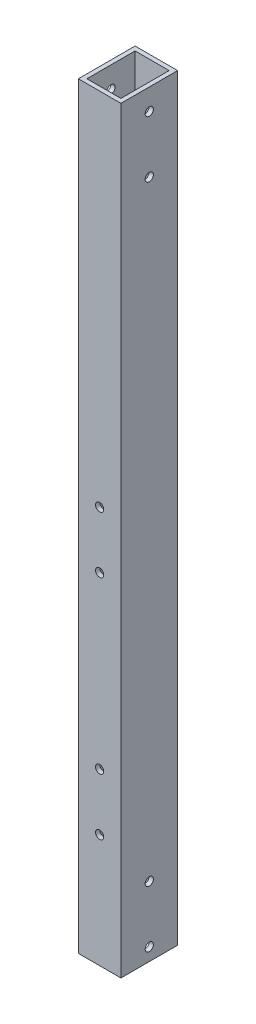
ISO-10303-21;
HEADER;
FILE_DESCRIPTION(('STEP AP214'),'2;1');
FILE_NAME('part.step','',(''),(''),'','','');
FILE_SCHEMA(('AUTOMOTIVE_DESIGN { 1 0 10303 214 1 1 1 1 }'));
ENDSEC;
DATA;
#1=APPLICATION_CONTEXT('core data for automotive mechanical design processes');
#2=APPLICATION_PROTOCOL_DEFINITION('international standard','automotive_design',2000,#1);
#3=PRODUCT_CONTEXT('',#1,'mechanical');
#4=PRODUCT('Part','Part','',(#3));
#5=PRODUCT_RELATED_PRODUCT_CATEGORY('part','',(#4));
#6=PRODUCT_DEFINITION_FORMATION('','',#4);
#7=PRODUCT_DEFINITION_CONTEXT('part definition',#1,'design');
#8=PRODUCT_DEFINITION('design','',#6,#7);
#9=PRODUCT_DEFINITION_SHAPE('','',#8);
#10=(LENGTH_UNIT() NAMED_UNIT(*) SI_UNIT(.MILLI.,.METRE.));
#11=(NAMED_UNIT(*) PLANE_ANGLE_UNIT() SI_UNIT($,.RADIAN.));
#12=(NAMED_UNIT(*) SI_UNIT($,.STERADIAN.) SOLID_ANGLE_UNIT());
#13=UNCERTAINTY_MEASURE_WITH_UNIT(LENGTH_MEASURE(1.E-05),#10,'distance_accuracy_value','');
#14=(GEOMETRIC_REPRESENTATION_CONTEXT(3) GLOBAL_UNCERTAINTY_ASSIGNED_CONTEXT((#13)) GLOBAL_UNIT_ASSIGNED_CONTEXT((#10,
#11,#12)) REPRESENTATION_CONTEXT('',''));
#15=CARTESIAN_POINT('',(0.,0.,0.));
#16=DIRECTION('',(0.,0.,1.));
#17=DIRECTION('',(1.,0.,0.));
#18=AXIS2_PLACEMENT_3D('',#15,#16,#17);
#19=CARTESIAN_POINT('',(0.,267.,0.));
#20=DIRECTION('',(0.,1.,0.));
#21=DIRECTION('',(0.,0.,1.));
#22=AXIS2_PLACEMENT_3D('',#19,#20,#21);
#23=PLANE('',#22);
#24=DIRECTION('',(0.,0.,-1.));
#25=VECTOR('',#24,1.);
#26=CARTESIAN_POINT('',(7.5,267.,10.));
#27=LINE('',#26,#25);
#28=CARTESIAN_POINT('',(7.5,267.,10.));
#29=VERTEX_POINT('',#28);
#30=CARTESIAN_POINT('',(7.5,267.,-10.));
#31=VERTEX_POINT('',#30);
#32=EDGE_CURVE('E187',#29,#31,#27,.T.);
#33=ORIENTED_EDGE('',*,*,#32,.T.);
#34=DIRECTION('',(-1.,0.,0.));
#35=VECTOR('',#34,1.);
#36=CARTESIAN_POINT('',(-7.5,267.,-10.));
#37=LINE('',#36,#35);
#38=CARTESIAN_POINT('',(-7.5,267.,-10.));
#39=VERTEX_POINT('',#38);
#40=EDGE_CURVE('E191',#31,#39,#37,.T.);
#41=ORIENTED_EDGE('',*,*,#40,.T.);
#42=DIRECTION('',(0.,0.,1.));
#43=VECTOR('',#42,1.);
#44=CARTESIAN_POINT('',(-7.5,267.,10.));
#45=LINE('',#44,#43);
#46=CARTESIAN_POINT('',(-7.5,267.,10.));
#47=VERTEX_POINT('',#46);
#48=EDGE_CURVE('E195',#39,#47,#45,.T.);
#49=ORIENTED_EDGE('',*,*,#48,.T.);
#50=DIRECTION('',(1.,0.,0.));
#51=VECTOR('',#50,1.);
#52=CARTESIAN_POINT('',(-7.5,267.,10.));
#53=LINE('',#52,#51);
#54=EDGE_CURVE('E198',#47,#29,#53,.T.);
#55=ORIENTED_EDGE('',*,*,#54,.T.);
#56=EDGE_LOOP('',(#33,#41,#49,#55));
#57=FACE_BOUND('',#56,.T.);
#58=DIRECTION('',(-1.,0.,0.));
#59=VECTOR('',#58,1.);
#60=CARTESIAN_POINT('',(0.,267.,-8.5));
#61=LINE('',#60,#59);
#62=CARTESIAN_POINT('',(6.,267.,-8.5));
#63=VERTEX_POINT('',#62);
#64=CARTESIAN_POINT('',(-6.,267.,-8.5));
#65=VERTEX_POINT('',#64);
#66=EDGE_CURVE('E146',#63,#65,#61,.T.);
#67=ORIENTED_EDGE('',*,*,#66,.F.);
#68=DIRECTION('',(0.,0.,-1.));
#69=VECTOR('',#68,1.);
#70=CARTESIAN_POINT('',(6.,267.,0.));
#71=LINE('',#70,#69);
#72=CARTESIAN_POINT('',(6.,267.,8.5));
#73=VERTEX_POINT('',#72);
#74=EDGE_CURVE('E137',#73,#63,#71,.T.);
#75=ORIENTED_EDGE('',*,*,#74,.F.);
#76=DIRECTION('',(1.,0.,0.));
#77=VECTOR('',#76,1.);
#78=CARTESIAN_POINT('',(0.,267.,8.5));
#79=LINE('',#78,#77);
#80=CARTESIAN_POINT('',(-6.,267.,8.5));
#81=VERTEX_POINT('',#80);
#82=EDGE_CURVE('E163',#81,#73,#79,.T.);
#83=ORIENTED_EDGE('',*,*,#82,.F.);
#84=DIRECTION('',(0.,0.,1.));
#85=VECTOR('',#84,1.);
#86=CARTESIAN_POINT('',(-6.,267.,0.));
#87=LINE('',#86,#85);
#88=EDGE_CURVE('E159',#65,#81,#87,.T.);
#89=ORIENTED_EDGE('',*,*,#88,.F.);
#90=EDGE_LOOP('',(#67,#75,#83,#89));
#91=FACE_BOUND('',#90,.T.);
#92=ADVANCED_FACE('F69',(#57,#91),#23,.T.);
#93=CARTESIAN_POINT('',(0.,0.,0.));
#94=DIRECTION('',(0.,1.,0.));
#95=DIRECTION('',(0.,0.,1.));
#96=AXIS2_PLACEMENT_3D('',#93,#94,#95);
#97=PLANE('',#96);
#98=DIRECTION('',(0.,0.,-1.));
#99=VECTOR('',#98,1.);
#100=CARTESIAN_POINT('',(7.5,0.,10.));
#101=LINE('',#100,#99);
#102=CARTESIAN_POINT('',(7.5,0.,10.));
#103=VERTEX_POINT('',#102);
#104=CARTESIAN_POINT('',(7.5,0.,-10.));
#105=VERTEX_POINT('',#104);
#106=EDGE_CURVE('E155',#103,#105,#101,.T.);
#107=ORIENTED_EDGE('',*,*,#106,.F.);
#108=DIRECTION('',(1.,0.,0.));
#109=VECTOR('',#108,1.);
#110=CARTESIAN_POINT('',(-7.5,0.,10.));
#111=LINE('',#110,#109);
#112=CARTESIAN_POINT('',(-7.5,0.,10.));
#113=VERTEX_POINT('',#112);
#114=EDGE_CURVE('E192',#113,#103,#111,.T.);
#115=ORIENTED_EDGE('',*,*,#114,.F.);
#116=DIRECTION('',(0.,0.,1.));
#117=VECTOR('',#116,1.);
#118=CARTESIAN_POINT('',(-7.5,0.,10.));
#119=LINE('',#118,#117);
#120=CARTESIAN_POINT('',(-7.5,0.,-10.));
#121=VERTEX_POINT('',#120);
#122=EDGE_CURVE('E208',#121,#113,#119,.T.);
#123=ORIENTED_EDGE('',*,*,#122,.F.);
#124=DIRECTION('',(-1.,0.,0.));
#125=VECTOR('',#124,1.);
#126=CARTESIAN_POINT('',(-7.5,0.,-10.));
#127=LINE('',#126,#125);
#128=EDGE_CURVE('E205',#105,#121,#127,.T.);
#129=ORIENTED_EDGE('',*,*,#128,.F.);
#130=EDGE_LOOP('',(#107,#115,#123,#129));
#131=FACE_BOUND('',#130,.T.);
#132=DIRECTION('',(0.,0.,-1.));
#133=VECTOR('',#132,1.);
#134=CARTESIAN_POINT('',(6.,0.,0.));
#135=LINE('',#134,#133);
#136=CARTESIAN_POINT('',(6.,0.,8.5));
#137=VERTEX_POINT('',#136);
#138=CARTESIAN_POINT('',(6.,0.,-8.5));
#139=VERTEX_POINT('',#138);
#140=EDGE_CURVE('E95',#137,#139,#135,.T.);
#141=ORIENTED_EDGE('',*,*,#140,.T.);
#142=DIRECTION('',(-1.,0.,0.));
#143=VECTOR('',#142,1.);
#144=CARTESIAN_POINT('',(0.,0.,-8.5));
#145=LINE('',#144,#143);
#146=CARTESIAN_POINT('',(-6.,0.,-8.5));
#147=VERTEX_POINT('',#146);
#148=EDGE_CURVE('E153',#139,#147,#145,.T.);
#149=ORIENTED_EDGE('',*,*,#148,.T.);
#150=DIRECTION('',(0.,0.,1.));
#151=VECTOR('',#150,1.);
#152=CARTESIAN_POINT('',(-6.,0.,0.));
#153=LINE('',#152,#151);
#154=CARTESIAN_POINT('',(-6.,0.,8.5));
#155=VERTEX_POINT('',#154);
#156=EDGE_CURVE('E174',#147,#155,#153,.T.);
#157=ORIENTED_EDGE('',*,*,#156,.T.);
#158=DIRECTION('',(1.,0.,0.));
#159=VECTOR('',#158,1.);
#160=CARTESIAN_POINT('',(0.,0.,8.5));
#161=LINE('',#160,#159);
#162=EDGE_CURVE('E147',#155,#137,#161,.T.);
#163=ORIENTED_EDGE('',*,*,#162,.T.);
#164=EDGE_LOOP('',(#141,#149,#157,#163));
#165=FACE_BOUND('',#164,.T.);
#166=ADVANCED_FACE('F342',(#131,#165),#97,.F.);
#167=CARTESIAN_POINT('',(7.5,267.,10.));
#168=DIRECTION('',(-1.,0.,0.));
#169=DIRECTION('',(0.,0.,1.));
#170=AXIS2_PLACEMENT_3D('',#167,#168,#169);
#171=PLANE('',#170);
#172=CARTESIAN_POINT('',(7.5,259.5,0.));
#173=DIRECTION('',(1.,0.,0.));
#174=DIRECTION('',(0.,0.,-1.));
#175=AXIS2_PLACEMENT_3D('',#172,#173,#174);
#176=CIRCLE('',#175,1.44999999999999);
#177=CARTESIAN_POINT('',(7.5,259.5,-1.44999999999999));
#178=VERTEX_POINT('',#177);
#179=EDGE_CURVE('E278',#178,#178,#176,.T.);
#180=ORIENTED_EDGE('',*,*,#179,.F.);
#181=EDGE_LOOP('',(#180));
#182=FACE_BOUND('',#181,.T.);
#183=CARTESIAN_POINT('',(7.5,239.5,0.));
#184=DIRECTION('',(1.,0.,0.));
#185=DIRECTION('',(0.,0.,-1.));
#186=AXIS2_PLACEMENT_3D('',#183,#184,#185);
#187=CIRCLE('',#186,1.45);
#188=CARTESIAN_POINT('',(7.5,239.5,-1.45));
#189=VERTEX_POINT('',#188);
#190=EDGE_CURVE('E282',#189,#189,#187,.T.);
#191=ORIENTED_EDGE('',*,*,#190,.F.);
#192=EDGE_LOOP('',(#191));
#193=FACE_BOUND('',#192,.T.);
#194=CARTESIAN_POINT('',(7.5,24.5,0.));
#195=DIRECTION('',(1.,0.,0.));
#196=DIRECTION('',(0.,0.,-1.));
#197=AXIS2_PLACEMENT_3D('',#194,#195,#196);
#198=CIRCLE('',#197,1.45);
#199=CARTESIAN_POINT('',(7.5,24.5,-1.45));
#200=VERTEX_POINT('',#199);
#201=EDGE_CURVE('E290',#200,#200,#198,.T.);
#202=ORIENTED_EDGE('',*,*,#201,.F.);
#203=EDGE_LOOP('',(#202));
#204=FACE_BOUND('',#203,.T.);
#205=CARTESIAN_POINT('',(7.5,4.5,0.));
#206=DIRECTION('',(1.,0.,0.));
#207=DIRECTION('',(0.,0.,-1.));
#208=AXIS2_PLACEMENT_3D('',#205,#206,#207);
#209=CIRCLE('',#208,1.45);
#210=CARTESIAN_POINT('',(7.5,4.5,-1.45));
#211=VERTEX_POINT('',#210);
#212=EDGE_CURVE('E298',#211,#211,#209,.T.);
#213=ORIENTED_EDGE('',*,*,#212,.F.);
#214=EDGE_LOOP('',(#213));
#215=FACE_BOUND('',#214,.T.);
#216=ORIENTED_EDGE('',*,*,#106,.T.);
#217=DIRECTION('',(0.,-1.,0.));
#218=VECTOR('',#217,1.);
#219=CARTESIAN_POINT('',(7.5,267.,-10.));
#220=LINE('',#219,#218);
#221=EDGE_CURVE('E12',#31,#105,#220,.T.);
#222=ORIENTED_EDGE('',*,*,#221,.F.);
#223=ORIENTED_EDGE('',*,*,#32,.F.);
#224=DIRECTION('',(0.,-1.,0.));
#225=VECTOR('',#224,1.);
#226=CARTESIAN_POINT('',(7.5,267.,10.));
#227=LINE('',#226,#225);
#228=EDGE_CURVE('E201',#29,#103,#227,.T.);
#229=ORIENTED_EDGE('',*,*,#228,.T.);
#230=EDGE_LOOP('',(#216,#222,#223,#229));
#231=FACE_BOUND('',#230,.T.);
#232=ADVANCED_FACE('F71',(#182,#193,#204,#215,#231),#171,.F.);
#233=CARTESIAN_POINT('',(-7.5,267.,-10.));
#234=DIRECTION('',(0.,0.,1.));
#235=DIRECTION('',(1.,0.,0.));
#236=AXIS2_PLACEMENT_3D('',#233,#234,#235);
#237=PLANE('',#236);
#238=CARTESIAN_POINT('',(0.,40.,-10.));
#239=DIRECTION('',(0.,0.,1.));
#240=DIRECTION('',(1.,0.,0.));
#241=AXIS2_PLACEMENT_3D('',#238,#239,#240);
#242=CIRCLE('',#241,1.45);
#243=CARTESIAN_POINT('',(1.45,40.,-10.));
#244=VERTEX_POINT('',#243);
#245=EDGE_CURVE('E248',#244,#244,#242,.T.);
#246=ORIENTED_EDGE('',*,*,#245,.T.);
#247=EDGE_LOOP('',(#246));
#248=FACE_BOUND('',#247,.T.);
#249=CARTESIAN_POINT('',(0.,60.,-10.));
#250=DIRECTION('',(0.,0.,1.));
#251=DIRECTION('',(1.,0.,0.));
#252=AXIS2_PLACEMENT_3D('',#249,#250,#251);
#253=CIRCLE('',#252,1.45);
#254=CARTESIAN_POINT('',(1.45,60.,-10.));
#255=VERTEX_POINT('',#254);
#256=EDGE_CURVE('E449',#255,#255,#253,.T.);
#257=ORIENTED_EDGE('',*,*,#256,.T.);
#258=EDGE_LOOP('',(#257));
#259=FACE_BOUND('',#258,.T.);
#260=CARTESIAN_POINT('',(0.,120.,-10.));
#261=DIRECTION('',(0.,0.,1.));
#262=DIRECTION('',(1.,0.,0.));
#263=AXIS2_PLACEMENT_3D('',#260,#261,#262);
#264=CIRCLE('',#263,1.45);
#265=CARTESIAN_POINT('',(1.45,120.,-10.));
#266=VERTEX_POINT('',#265);
#267=EDGE_CURVE('E457',#266,#266,#264,.T.);
#268=ORIENTED_EDGE('',*,*,#267,.T.);
#269=EDGE_LOOP('',(#268));
#270=FACE_BOUND('',#269,.T.);
#271=CARTESIAN_POINT('',(0.,140.,-10.));
#272=DIRECTION('',(0.,0.,1.));
#273=DIRECTION('',(1.,0.,0.));
#274=AXIS2_PLACEMENT_3D('',#271,#272,#273);
#275=CIRCLE('',#274,1.45);
#276=CARTESIAN_POINT('',(1.45,140.,-10.));
#277=VERTEX_POINT('',#276);
#278=EDGE_CURVE('E464',#277,#277,#275,.T.);
#279=ORIENTED_EDGE('',*,*,#278,.T.);
#280=EDGE_LOOP('',(#279));
#281=FACE_BOUND('',#280,.T.);
#282=ORIENTED_EDGE('',*,*,#128,.T.);
#283=DIRECTION('',(0.,-1.,0.));
#284=VECTOR('',#283,1.);
#285=CARTESIAN_POINT('',(-7.5,267.,-10.));
#286=LINE('',#285,#284);
#287=EDGE_CURVE('E79',#39,#121,#286,.T.);
#288=ORIENTED_EDGE('',*,*,#287,.F.);
#289=ORIENTED_EDGE('',*,*,#40,.F.);
#290=ORIENTED_EDGE('',*,*,#221,.T.);
#291=EDGE_LOOP('',(#282,#288,#289,#290));
#292=FACE_BOUND('',#291,.T.);
#293=ADVANCED_FACE('F341',(#248,#259,#270,#281,#292),#237,.F.);
#294=CARTESIAN_POINT('',(-7.5,267.,10.));
#295=DIRECTION('',(1.,0.,0.));
#296=DIRECTION('',(0.,0.,-1.));
#297=AXIS2_PLACEMENT_3D('',#294,#295,#296);
#298=PLANE('',#297);
#299=CARTESIAN_POINT('',(-7.5,259.5,0.));
#300=DIRECTION('',(1.,0.,0.));
#301=DIRECTION('',(0.,0.,-1.));
#302=AXIS2_PLACEMENT_3D('',#299,#300,#301);
#303=CIRCLE('',#302,1.44999999999999);
#304=CARTESIAN_POINT('',(-7.5,259.5,-1.44999999999999));
#305=VERTEX_POINT('',#304);
#306=EDGE_CURVE('E228',#305,#305,#303,.T.);
#307=ORIENTED_EDGE('',*,*,#306,.T.);
#308=EDGE_LOOP('',(#307));
#309=FACE_BOUND('',#308,.T.);
#310=CARTESIAN_POINT('',(-7.5,239.5,0.));
#311=DIRECTION('',(1.,0.,0.));
#312=DIRECTION('',(0.,0.,-1.));
#313=AXIS2_PLACEMENT_3D('',#310,#311,#312);
#314=CIRCLE('',#313,1.45);
#315=CARTESIAN_POINT('',(-7.5,239.5,-1.45));
#316=VERTEX_POINT('',#315);
#317=EDGE_CURVE('E286',#316,#316,#314,.T.);
#318=ORIENTED_EDGE('',*,*,#317,.T.);
#319=EDGE_LOOP('',(#318));
#320=FACE_BOUND('',#319,.T.);
#321=CARTESIAN_POINT('',(-7.5,24.5,0.));
#322=DIRECTION('',(1.,0.,0.));
#323=DIRECTION('',(0.,0.,-1.));
#324=AXIS2_PLACEMENT_3D('',#321,#322,#323);
#325=CIRCLE('',#324,1.45);
#326=CARTESIAN_POINT('',(-7.5,24.5,-1.45));
#327=VERTEX_POINT('',#326);
#328=EDGE_CURVE('E294',#327,#327,#325,.T.);
#329=ORIENTED_EDGE('',*,*,#328,.T.);
#330=EDGE_LOOP('',(#329));
#331=FACE_BOUND('',#330,.T.);
#332=CARTESIAN_POINT('',(-7.5,4.5,0.));
#333=DIRECTION('',(1.,0.,0.));
#334=DIRECTION('',(0.,0.,-1.));
#335=AXIS2_PLACEMENT_3D('',#332,#333,#334);
#336=CIRCLE('',#335,1.45);
#337=CARTESIAN_POINT('',(-7.5,4.5,-1.45));
#338=VERTEX_POINT('',#337);
#339=EDGE_CURVE('E274',#338,#338,#336,.T.);
#340=ORIENTED_EDGE('',*,*,#339,.T.);
#341=EDGE_LOOP('',(#340));
#342=FACE_BOUND('',#341,.T.);
#343=ORIENTED_EDGE('',*,*,#122,.T.);
#344=DIRECTION('',(0.,-1.,0.));
#345=VECTOR('',#344,1.);
#346=CARTESIAN_POINT('',(-7.5,267.,10.));
#347=LINE('',#346,#345);
#348=EDGE_CURVE('E216',#47,#113,#347,.T.);
#349=ORIENTED_EDGE('',*,*,#348,.F.);
#350=ORIENTED_EDGE('',*,*,#48,.F.);
#351=ORIENTED_EDGE('',*,*,#287,.T.);
#352=EDGE_LOOP('',(#343,#349,#350,#351));
#353=FACE_BOUND('',#352,.T.);
#354=ADVANCED_FACE('F360',(#309,#320,#331,#342,#353),#298,.F.);
#355=CARTESIAN_POINT('',(-7.5,267.,10.));
#356=DIRECTION('',(0.,0.,-1.));
#357=DIRECTION('',(-1.,0.,0.));
#358=AXIS2_PLACEMENT_3D('',#355,#356,#357);
#359=PLANE('',#358);
#360=CARTESIAN_POINT('',(0.,40.,10.));
#361=DIRECTION('',(0.,0.,1.));
#362=DIRECTION('',(1.,0.,0.));
#363=AXIS2_PLACEMENT_3D('',#360,#361,#362);
#364=CIRCLE('',#363,1.45);
#365=CARTESIAN_POINT('',(1.45,40.,10.));
#366=VERTEX_POINT('',#365);
#367=EDGE_CURVE('E439',#366,#366,#364,.T.);
#368=ORIENTED_EDGE('',*,*,#367,.F.);
#369=EDGE_LOOP('',(#368));
#370=FACE_BOUND('',#369,.T.);
#371=CARTESIAN_POINT('',(0.,60.,10.));
#372=DIRECTION('',(0.,0.,1.));
#373=DIRECTION('',(1.,0.,0.));
#374=AXIS2_PLACEMENT_3D('',#371,#372,#373);
#375=CIRCLE('',#374,1.45);
#376=CARTESIAN_POINT('',(1.45,60.,10.));
#377=VERTEX_POINT('',#376);
#378=EDGE_CURVE('E443',#377,#377,#375,.T.);
#379=ORIENTED_EDGE('',*,*,#378,.F.);
#380=EDGE_LOOP('',(#379));
#381=FACE_BOUND('',#380,.T.);
#382=CARTESIAN_POINT('',(0.,120.,10.));
#383=DIRECTION('',(0.,0.,1.));
#384=DIRECTION('',(1.,0.,0.));
#385=AXIS2_PLACEMENT_3D('',#382,#383,#384);
#386=CIRCLE('',#385,1.45);
#387=CARTESIAN_POINT('',(1.45,120.,10.));
#388=VERTEX_POINT('',#387);
#389=EDGE_CURVE('E453',#388,#388,#386,.T.);
#390=ORIENTED_EDGE('',*,*,#389,.F.);
#391=EDGE_LOOP('',(#390));
#392=FACE_BOUND('',#391,.T.);
#393=CARTESIAN_POINT('',(0.,140.,10.));
#394=DIRECTION('',(0.,0.,1.));
#395=DIRECTION('',(1.,0.,0.));
#396=AXIS2_PLACEMENT_3D('',#393,#394,#395);
#397=CIRCLE('',#396,1.45);
#398=CARTESIAN_POINT('',(1.45,140.,10.));
#399=VERTEX_POINT('',#398);
#400=EDGE_CURVE('E461',#399,#399,#397,.T.);
#401=ORIENTED_EDGE('',*,*,#400,.F.);
#402=EDGE_LOOP('',(#401));
#403=FACE_BOUND('',#402,.T.);
#404=ORIENTED_EDGE('',*,*,#114,.T.);
#405=ORIENTED_EDGE('',*,*,#228,.F.);
#406=ORIENTED_EDGE('',*,*,#54,.F.);
#407=ORIENTED_EDGE('',*,*,#348,.T.);
#408=EDGE_LOOP('',(#404,#405,#406,#407));
#409=FACE_BOUND('',#408,.T.);
#410=ADVANCED_FACE('F322',(#370,#381,#392,#403,#409),#359,.F.);
#411=CARTESIAN_POINT('',(6.,267.,0.));
#412=DIRECTION('',(-1.,0.,0.));
#413=DIRECTION('',(0.,0.,1.));
#414=AXIS2_PLACEMENT_3D('',#411,#412,#413);
#415=PLANE('',#414);
#416=CARTESIAN_POINT('',(6.,259.5,0.));
#417=DIRECTION('',(-1.,0.,0.));
#418=DIRECTION('',(0.,0.,1.));
#419=AXIS2_PLACEMENT_3D('',#416,#417,#418);
#420=CIRCLE('',#419,1.44999999999999);
#421=CARTESIAN_POINT('',(6.,259.5,1.44999999999999));
#422=VERTEX_POINT('',#421);
#423=EDGE_CURVE('E171',#422,#422,#420,.T.);
#424=ORIENTED_EDGE('',*,*,#423,.F.);
#425=EDGE_LOOP('',(#424));
#426=FACE_BOUND('',#425,.T.);
#427=CARTESIAN_POINT('',(6.,239.5,0.));
#428=DIRECTION('',(-1.,0.,0.));
#429=DIRECTION('',(0.,0.,1.));
#430=AXIS2_PLACEMENT_3D('',#427,#428,#429);
#431=CIRCLE('',#430,1.45);
#432=CARTESIAN_POINT('',(6.,239.5,1.45));
#433=VERTEX_POINT('',#432);
#434=EDGE_CURVE('E238',#433,#433,#431,.T.);
#435=ORIENTED_EDGE('',*,*,#434,.F.);
#436=EDGE_LOOP('',(#435));
#437=FACE_BOUND('',#436,.T.);
#438=CARTESIAN_POINT('',(6.,24.5,0.));
#439=DIRECTION('',(-1.,0.,0.));
#440=DIRECTION('',(0.,0.,1.));
#441=AXIS2_PLACEMENT_3D('',#438,#439,#440);
#442=CIRCLE('',#441,1.45);
#443=CARTESIAN_POINT('',(6.,24.5,1.45));
#444=VERTEX_POINT('',#443);
#445=EDGE_CURVE('E233',#444,#444,#442,.T.);
#446=ORIENTED_EDGE('',*,*,#445,.F.);
#447=EDGE_LOOP('',(#446));
#448=FACE_BOUND('',#447,.T.);
#449=CARTESIAN_POINT('',(6.,4.5,0.));
#450=DIRECTION('',(-1.,0.,0.));
#451=DIRECTION('',(0.,0.,1.));
#452=AXIS2_PLACEMENT_3D('',#449,#450,#451);
#453=CIRCLE('',#452,1.45);
#454=CARTESIAN_POINT('',(6.,4.5,1.45));
#455=VERTEX_POINT('',#454);
#456=EDGE_CURVE('E227',#455,#455,#453,.T.);
#457=ORIENTED_EDGE('',*,*,#456,.F.);
#458=EDGE_LOOP('',(#457));
#459=FACE_BOUND('',#458,.T.);
#460=ORIENTED_EDGE('',*,*,#140,.F.);
#461=DIRECTION('',(0.,-1.,0.));
#462=VECTOR('',#461,1.);
#463=CARTESIAN_POINT('',(6.,267.,8.5));
#464=LINE('',#463,#462);
#465=EDGE_CURVE('E141',#73,#137,#464,.T.);
#466=ORIENTED_EDGE('',*,*,#465,.F.);
#467=ORIENTED_EDGE('',*,*,#74,.T.);
#468=DIRECTION('',(0.,-1.,0.));
#469=VECTOR('',#468,1.);
#470=CARTESIAN_POINT('',(6.,267.,-8.5));
#471=LINE('',#470,#469);
#472=EDGE_CURVE('E140',#63,#139,#471,.T.);
#473=ORIENTED_EDGE('',*,*,#472,.T.);
#474=EDGE_LOOP('',(#460,#466,#467,#473));
#475=FACE_BOUND('',#474,.T.);
#476=ADVANCED_FACE('F139',(#426,#437,#448,#459,#475),#415,.T.);
#477=CARTESIAN_POINT('',(0.,267.,-8.5));
#478=DIRECTION('',(0.,0.,1.));
#479=DIRECTION('',(1.,0.,0.));
#480=AXIS2_PLACEMENT_3D('',#477,#478,#479);
#481=PLANE('',#480);
#482=CARTESIAN_POINT('',(0.,40.,-8.5));
#483=DIRECTION('',(0.,0.,1.));
#484=DIRECTION('',(1.,0.,0.));
#485=AXIS2_PLACEMENT_3D('',#482,#483,#484);
#486=CIRCLE('',#485,1.45);
#487=CARTESIAN_POINT('',(1.45,40.,-8.5));
#488=VERTEX_POINT('',#487);
#489=EDGE_CURVE('E270',#488,#488,#486,.T.);
#490=ORIENTED_EDGE('',*,*,#489,.F.);
#491=EDGE_LOOP('',(#490));
#492=FACE_BOUND('',#491,.T.);
#493=CARTESIAN_POINT('',(0.,60.,-8.5));
#494=DIRECTION('',(0.,0.,1.));
#495=DIRECTION('',(1.,0.,0.));
#496=AXIS2_PLACEMENT_3D('',#493,#494,#495);
#497=CIRCLE('',#496,1.45);
#498=CARTESIAN_POINT('',(1.45,60.,-8.5));
#499=VERTEX_POINT('',#498);
#500=EDGE_CURVE('E256',#499,#499,#497,.T.);
#501=ORIENTED_EDGE('',*,*,#500,.F.);
#502=EDGE_LOOP('',(#501));
#503=FACE_BOUND('',#502,.T.);
#504=CARTESIAN_POINT('',(0.,120.,-8.5));
#505=DIRECTION('',(0.,0.,1.));
#506=DIRECTION('',(1.,0.,0.));
#507=AXIS2_PLACEMENT_3D('',#504,#505,#506);
#508=CIRCLE('',#507,1.45);
#509=CARTESIAN_POINT('',(1.45,120.,-8.5));
#510=VERTEX_POINT('',#509);
#511=EDGE_CURVE('E252',#510,#510,#508,.T.);
#512=ORIENTED_EDGE('',*,*,#511,.F.);
#513=EDGE_LOOP('',(#512));
#514=FACE_BOUND('',#513,.T.);
#515=CARTESIAN_POINT('',(0.,140.,-8.5));
#516=DIRECTION('',(0.,0.,1.));
#517=DIRECTION('',(1.,0.,0.));
#518=AXIS2_PLACEMENT_3D('',#515,#516,#517);
#519=CIRCLE('',#518,1.45);
#520=CARTESIAN_POINT('',(1.45,140.,-8.5));
#521=VERTEX_POINT('',#520);
#522=EDGE_CURVE('E247',#521,#521,#519,.T.);
#523=ORIENTED_EDGE('',*,*,#522,.F.);
#524=EDGE_LOOP('',(#523));
#525=FACE_BOUND('',#524,.T.);
#526=ORIENTED_EDGE('',*,*,#148,.F.);
#527=ORIENTED_EDGE('',*,*,#472,.F.);
#528=ORIENTED_EDGE('',*,*,#66,.T.);
#529=DIRECTION('',(0.,-1.,0.));
#530=VECTOR('',#529,1.);
#531=CARTESIAN_POINT('',(-6.,267.,-8.5));
#532=LINE('',#531,#530);
#533=EDGE_CURVE('E156',#65,#147,#532,.T.);
#534=ORIENTED_EDGE('',*,*,#533,.T.);
#535=EDGE_LOOP('',(#526,#527,#528,#534));
#536=FACE_BOUND('',#535,.T.);
#537=ADVANCED_FACE('F150',(#492,#503,#514,#525,#536),#481,.T.);
#538=CARTESIAN_POINT('',(-6.,267.,0.));
#539=DIRECTION('',(1.,0.,0.));
#540=DIRECTION('',(0.,0.,-1.));
#541=AXIS2_PLACEMENT_3D('',#538,#539,#540);
#542=PLANE('',#541);
#543=CARTESIAN_POINT('',(-6.,259.5,0.));
#544=DIRECTION('',(1.,0.,0.));
#545=DIRECTION('',(0.,0.,-1.));
#546=AXIS2_PLACEMENT_3D('',#543,#544,#545);
#547=CIRCLE('',#546,1.44999999999999);
#548=CARTESIAN_POINT('',(-6.,259.5,-1.44999999999999));
#549=VERTEX_POINT('',#548);
#550=EDGE_CURVE('E239',#549,#549,#547,.T.);
#551=ORIENTED_EDGE('',*,*,#550,.F.);
#552=EDGE_LOOP('',(#551));
#553=FACE_BOUND('',#552,.T.);
#554=CARTESIAN_POINT('',(-6.,239.5,0.));
#555=DIRECTION('',(1.,0.,0.));
#556=DIRECTION('',(0.,0.,-1.));
#557=AXIS2_PLACEMENT_3D('',#554,#555,#556);
#558=CIRCLE('',#557,1.45);
#559=CARTESIAN_POINT('',(-6.,239.5,-1.45));
#560=VERTEX_POINT('',#559);
#561=EDGE_CURVE('E234',#560,#560,#558,.T.);
#562=ORIENTED_EDGE('',*,*,#561,.F.);
#563=EDGE_LOOP('',(#562));
#564=FACE_BOUND('',#563,.T.);
#565=CARTESIAN_POINT('',(-6.,24.5,0.));
#566=DIRECTION('',(1.,0.,0.));
#567=DIRECTION('',(0.,0.,-1.));
#568=AXIS2_PLACEMENT_3D('',#565,#566,#567);
#569=CIRCLE('',#568,1.45);
#570=CARTESIAN_POINT('',(-6.,24.5,-1.45));
#571=VERTEX_POINT('',#570);
#572=EDGE_CURVE('E229',#571,#571,#569,.T.);
#573=ORIENTED_EDGE('',*,*,#572,.F.);
#574=EDGE_LOOP('',(#573));
#575=FACE_BOUND('',#574,.T.);
#576=CARTESIAN_POINT('',(-6.,4.5,0.));
#577=DIRECTION('',(1.,0.,0.));
#578=DIRECTION('',(0.,0.,-1.));
#579=AXIS2_PLACEMENT_3D('',#576,#577,#578);
#580=CIRCLE('',#579,1.45);
#581=CARTESIAN_POINT('',(-6.,4.5,-1.45));
#582=VERTEX_POINT('',#581);
#583=EDGE_CURVE('E223',#582,#582,#580,.T.);
#584=ORIENTED_EDGE('',*,*,#583,.F.);
#585=EDGE_LOOP('',(#584));
#586=FACE_BOUND('',#585,.T.);
#587=ORIENTED_EDGE('',*,*,#156,.F.);
#588=ORIENTED_EDGE('',*,*,#533,.F.);
#589=ORIENTED_EDGE('',*,*,#88,.T.);
#590=DIRECTION('',(0.,-1.,0.));
#591=VECTOR('',#590,1.);
#592=CARTESIAN_POINT('',(-6.,267.,8.5));
#593=LINE('',#592,#591);
#594=EDGE_CURVE('E87',#81,#155,#593,.T.);
#595=ORIENTED_EDGE('',*,*,#594,.T.);
#596=EDGE_LOOP('',(#587,#588,#589,#595));
#597=FACE_BOUND('',#596,.T.);
#598=ADVANCED_FACE('F381',(#553,#564,#575,#586,#597),#542,.T.);
#599=CARTESIAN_POINT('',(0.,267.,8.5));
#600=DIRECTION('',(0.,0.,-1.));
#601=DIRECTION('',(-1.,0.,0.));
#602=AXIS2_PLACEMENT_3D('',#599,#600,#601);
#603=PLANE('',#602);
#604=CARTESIAN_POINT('',(0.,40.,8.5));
#605=DIRECTION('',(0.,0.,-1.));
#606=DIRECTION('',(-1.,0.,0.));
#607=AXIS2_PLACEMENT_3D('',#604,#605,#606);
#608=CIRCLE('',#607,1.45);
#609=CARTESIAN_POINT('',(-1.45,40.,8.5));
#610=VERTEX_POINT('',#609);
#611=EDGE_CURVE('E73',#610,#610,#608,.T.);
#612=ORIENTED_EDGE('',*,*,#611,.F.);
#613=EDGE_LOOP('',(#612));
#614=FACE_BOUND('',#613,.T.);
#615=CARTESIAN_POINT('',(0.,60.,8.5));
#616=DIRECTION('',(0.,0.,-1.));
#617=DIRECTION('',(-1.,0.,0.));
#618=AXIS2_PLACEMENT_3D('',#615,#616,#617);
#619=CIRCLE('',#618,1.45);
#620=CARTESIAN_POINT('',(-1.45,60.,8.5));
#621=VERTEX_POINT('',#620);
#622=EDGE_CURVE('E253',#621,#621,#619,.T.);
#623=ORIENTED_EDGE('',*,*,#622,.F.);
#624=EDGE_LOOP('',(#623));
#625=FACE_BOUND('',#624,.T.);
#626=CARTESIAN_POINT('',(0.,120.,8.5));
#627=DIRECTION('',(0.,0.,-1.));
#628=DIRECTION('',(-1.,0.,0.));
#629=AXIS2_PLACEMENT_3D('',#626,#627,#628);
#630=CIRCLE('',#629,1.45);
#631=CARTESIAN_POINT('',(-1.45,120.,8.5));
#632=VERTEX_POINT('',#631);
#633=EDGE_CURVE('E249',#632,#632,#630,.T.);
#634=ORIENTED_EDGE('',*,*,#633,.F.);
#635=EDGE_LOOP('',(#634));
#636=FACE_BOUND('',#635,.T.);
#637=CARTESIAN_POINT('',(0.,140.,8.5));
#638=DIRECTION('',(0.,0.,-1.));
#639=DIRECTION('',(-1.,0.,0.));
#640=AXIS2_PLACEMENT_3D('',#637,#638,#639);
#641=CIRCLE('',#640,1.45);
#642=CARTESIAN_POINT('',(-1.45,140.,8.5));
#643=VERTEX_POINT('',#642);
#644=EDGE_CURVE('E243',#643,#643,#641,.T.);
#645=ORIENTED_EDGE('',*,*,#644,.F.);
#646=EDGE_LOOP('',(#645));
#647=FACE_BOUND('',#646,.T.);
#648=ORIENTED_EDGE('',*,*,#162,.F.);
#649=ORIENTED_EDGE('',*,*,#594,.F.);
#650=ORIENTED_EDGE('',*,*,#82,.T.);
#651=ORIENTED_EDGE('',*,*,#465,.T.);
#652=EDGE_LOOP('',(#648,#649,#650,#651));
#653=FACE_BOUND('',#652,.T.);
#654=ADVANCED_FACE('F385',(#614,#625,#636,#647,#653),#603,.T.);
#655=CARTESIAN_POINT('',(-7.5,4.5,0.));
#656=DIRECTION('',(1.,0.,0.));
#657=DIRECTION('',(0.,0.,-1.));
#658=AXIS2_PLACEMENT_3D('',#655,#656,#657);
#659=CYLINDRICAL_SURFACE('',#658,1.45);
#660=ORIENTED_EDGE('',*,*,#583,.T.);
#661=EDGE_LOOP('',(#660));
#662=FACE_BOUND('',#661,.T.);
#663=ORIENTED_EDGE('',*,*,#339,.F.);
#664=EDGE_LOOP('',(#663));
#665=FACE_BOUND('',#664,.T.);
#666=ADVANCED_FACE('F336',(#662,#665),#659,.F.);
#667=CARTESIAN_POINT('',(-7.5,24.5,0.));
#668=DIRECTION('',(1.,0.,0.));
#669=DIRECTION('',(0.,0.,-1.));
#670=AXIS2_PLACEMENT_3D('',#667,#668,#669);
#671=CYLINDRICAL_SURFACE('',#670,1.45);
#672=ORIENTED_EDGE('',*,*,#572,.T.);
#673=EDGE_LOOP('',(#672));
#674=FACE_BOUND('',#673,.T.);
#675=ORIENTED_EDGE('',*,*,#328,.F.);
#676=EDGE_LOOP('',(#675));
#677=FACE_BOUND('',#676,.T.);
#678=ADVANCED_FACE('F391',(#674,#677),#671,.F.);
#679=CARTESIAN_POINT('',(-7.5,239.5,0.));
#680=DIRECTION('',(1.,0.,0.));
#681=DIRECTION('',(0.,0.,-1.));
#682=AXIS2_PLACEMENT_3D('',#679,#680,#681);
#683=CYLINDRICAL_SURFACE('',#682,1.45);
#684=ORIENTED_EDGE('',*,*,#561,.T.);
#685=EDGE_LOOP('',(#684));
#686=FACE_BOUND('',#685,.T.);
#687=ORIENTED_EDGE('',*,*,#317,.F.);
#688=EDGE_LOOP('',(#687));
#689=FACE_BOUND('',#688,.T.);
#690=ADVANCED_FACE('F395',(#686,#689),#683,.F.);
#691=CARTESIAN_POINT('',(-7.5,259.5,0.));
#692=DIRECTION('',(1.,0.,0.));
#693=DIRECTION('',(0.,0.,-1.));
#694=AXIS2_PLACEMENT_3D('',#691,#692,#693);
#695=CYLINDRICAL_SURFACE('',#694,1.44999999999999);
#696=ORIENTED_EDGE('',*,*,#550,.T.);
#697=EDGE_LOOP('',(#696));
#698=FACE_BOUND('',#697,.T.);
#699=ORIENTED_EDGE('',*,*,#306,.F.);
#700=EDGE_LOOP('',(#699));
#701=FACE_BOUND('',#700,.T.);
#702=ADVANCED_FACE('F334',(#698,#701),#695,.F.);
#703=ORIENTED_EDGE('',*,*,#456,.T.);
#704=EDGE_LOOP('',(#703));
#705=FACE_BOUND('',#704,.T.);
#706=ORIENTED_EDGE('',*,*,#212,.T.);
#707=EDGE_LOOP('',(#706));
#708=FACE_BOUND('',#707,.T.);
#709=ADVANCED_FACE('F330',(#705,#708),#659,.F.);
#710=ORIENTED_EDGE('',*,*,#445,.T.);
#711=EDGE_LOOP('',(#710));
#712=FACE_BOUND('',#711,.T.);
#713=ORIENTED_EDGE('',*,*,#201,.T.);
#714=EDGE_LOOP('',(#713));
#715=FACE_BOUND('',#714,.T.);
#716=ADVANCED_FACE('F333',(#712,#715),#671,.F.);
#717=ORIENTED_EDGE('',*,*,#434,.T.);
#718=EDGE_LOOP('',(#717));
#719=FACE_BOUND('',#718,.T.);
#720=ORIENTED_EDGE('',*,*,#190,.T.);
#721=EDGE_LOOP('',(#720));
#722=FACE_BOUND('',#721,.T.);
#723=ADVANCED_FACE('F400',(#719,#722),#683,.F.);
#724=ORIENTED_EDGE('',*,*,#423,.T.);
#725=EDGE_LOOP('',(#724));
#726=FACE_BOUND('',#725,.T.);
#727=ORIENTED_EDGE('',*,*,#179,.T.);
#728=EDGE_LOOP('',(#727));
#729=FACE_BOUND('',#728,.T.);
#730=ADVANCED_FACE('F317',(#726,#729),#695,.F.);
#731=CARTESIAN_POINT('',(0.,140.,-10.));
#732=DIRECTION('',(0.,0.,1.));
#733=DIRECTION('',(1.,0.,0.));
#734=AXIS2_PLACEMENT_3D('',#731,#732,#733);
#735=CYLINDRICAL_SURFACE('',#734,1.45);
#736=ORIENTED_EDGE('',*,*,#644,.T.);
#737=EDGE_LOOP('',(#736));
#738=FACE_BOUND('',#737,.T.);
#739=ORIENTED_EDGE('',*,*,#400,.T.);
#740=EDGE_LOOP('',(#739));
#741=FACE_BOUND('',#740,.T.);
#742=ADVANCED_FACE('F404',(#738,#741),#735,.F.);
#743=CARTESIAN_POINT('',(0.,120.,-10.));
#744=DIRECTION('',(0.,0.,1.));
#745=DIRECTION('',(1.,0.,0.));
#746=AXIS2_PLACEMENT_3D('',#743,#744,#745);
#747=CYLINDRICAL_SURFACE('',#746,1.45);
#748=ORIENTED_EDGE('',*,*,#633,.T.);
#749=EDGE_LOOP('',(#748));
#750=FACE_BOUND('',#749,.T.);
#751=ORIENTED_EDGE('',*,*,#389,.T.);
#752=EDGE_LOOP('',(#751));
#753=FACE_BOUND('',#752,.T.);
#754=ADVANCED_FACE('F407',(#750,#753),#747,.F.);
#755=CARTESIAN_POINT('',(0.,60.,-10.));
#756=DIRECTION('',(0.,0.,1.));
#757=DIRECTION('',(1.,0.,0.));
#758=AXIS2_PLACEMENT_3D('',#755,#756,#757);
#759=CYLINDRICAL_SURFACE('',#758,1.45);
#760=ORIENTED_EDGE('',*,*,#622,.T.);
#761=EDGE_LOOP('',(#760));
#762=FACE_BOUND('',#761,.T.);
#763=ORIENTED_EDGE('',*,*,#378,.T.);
#764=EDGE_LOOP('',(#763));
#765=FACE_BOUND('',#764,.T.);
#766=ADVANCED_FACE('F412',(#762,#765),#759,.F.);
#767=CARTESIAN_POINT('',(0.,40.,-10.));
#768=DIRECTION('',(0.,0.,1.));
#769=DIRECTION('',(1.,0.,0.));
#770=AXIS2_PLACEMENT_3D('',#767,#768,#769);
#771=CYLINDRICAL_SURFACE('',#770,1.45);
#772=ORIENTED_EDGE('',*,*,#611,.T.);
#773=EDGE_LOOP('',(#772));
#774=FACE_BOUND('',#773,.T.);
#775=ORIENTED_EDGE('',*,*,#367,.T.);
#776=EDGE_LOOP('',(#775));
#777=FACE_BOUND('',#776,.T.);
#778=ADVANCED_FACE('F417',(#774,#777),#771,.F.);
#779=ORIENTED_EDGE('',*,*,#522,.T.);
#780=EDGE_LOOP('',(#779));
#781=FACE_BOUND('',#780,.T.);
#782=ORIENTED_EDGE('',*,*,#278,.F.);
#783=EDGE_LOOP('',(#782));
#784=FACE_BOUND('',#783,.T.);
#785=ADVANCED_FACE('F409',(#781,#784),#735,.F.);
#786=ORIENTED_EDGE('',*,*,#511,.T.);
#787=EDGE_LOOP('',(#786));
#788=FACE_BOUND('',#787,.T.);
#789=ORIENTED_EDGE('',*,*,#267,.F.);
#790=EDGE_LOOP('',(#789));
#791=FACE_BOUND('',#790,.T.);
#792=ADVANCED_FACE('F414',(#788,#791),#747,.F.);
#793=ORIENTED_EDGE('',*,*,#500,.T.);
#794=EDGE_LOOP('',(#793));
#795=FACE_BOUND('',#794,.T.);
#796=ORIENTED_EDGE('',*,*,#256,.F.);
#797=EDGE_LOOP('',(#796));
#798=FACE_BOUND('',#797,.T.);
#799=ADVANCED_FACE('F418',(#795,#798),#759,.F.);
#800=ORIENTED_EDGE('',*,*,#489,.T.);
#801=EDGE_LOOP('',(#800));
#802=FACE_BOUND('',#801,.T.);
#803=ORIENTED_EDGE('',*,*,#245,.F.);
#804=EDGE_LOOP('',(#803));
#805=FACE_BOUND('',#804,.T.);
#806=ADVANCED_FACE('F421',(#802,#805),#771,.F.);
#807=CLOSED_SHELL('',(#92,#166,#232,#293,#354,#410,#476,#537,#598,#654,#666,#678,#690,#702,#709,
#716,#723,#730,#742,#754,#766,#778,#785,#792,#799,#806));
#808=MANIFOLD_SOLID_BREP('B2',#807);
#809=ADVANCED_BREP_SHAPE_REPRESENTATION('',(#18,#808),#14);
#810=SHAPE_DEFINITION_REPRESENTATION(#9,#809);
ENDSEC;
END-ISO-10303-21;
